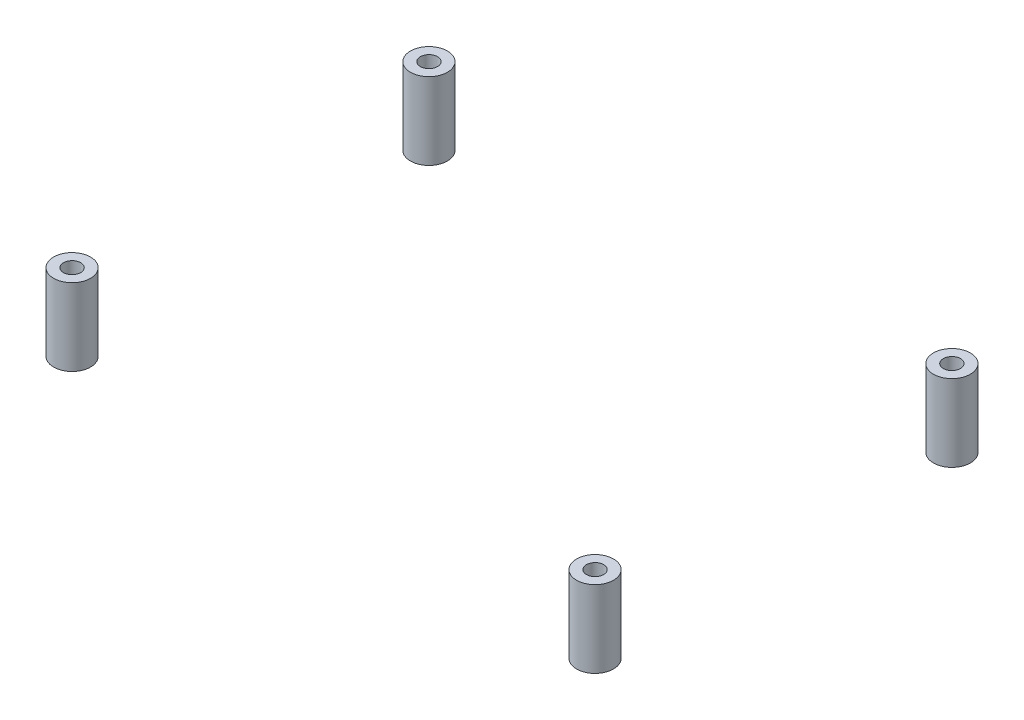
ISO-10303-21;
HEADER;
FILE_DESCRIPTION(('STEP AP214'),'2;1');
FILE_NAME('part.step','',(''),(''),'','','');
FILE_SCHEMA(('AUTOMOTIVE_DESIGN { 1 0 10303 214 1 1 1 1 }'));
ENDSEC;
DATA;
#1=APPLICATION_CONTEXT('core data for automotive mechanical design processes');
#2=APPLICATION_PROTOCOL_DEFINITION('international standard','automotive_design',2000,#1);
#3=PRODUCT_CONTEXT('',#1,'mechanical');
#4=PRODUCT('Part','Part','',(#3));
#5=PRODUCT_RELATED_PRODUCT_CATEGORY('part','',(#4));
#6=PRODUCT_DEFINITION_FORMATION('','',#4);
#7=PRODUCT_DEFINITION_CONTEXT('part definition',#1,'design');
#8=PRODUCT_DEFINITION('design','',#6,#7);
#9=PRODUCT_DEFINITION_SHAPE('','',#8);
#10=(LENGTH_UNIT() NAMED_UNIT(*) SI_UNIT(.MILLI.,.METRE.));
#11=(NAMED_UNIT(*) PLANE_ANGLE_UNIT() SI_UNIT($,.RADIAN.));
#12=(NAMED_UNIT(*) SI_UNIT($,.STERADIAN.) SOLID_ANGLE_UNIT());
#13=UNCERTAINTY_MEASURE_WITH_UNIT(LENGTH_MEASURE(1.E-05),#10,'distance_accuracy_value','');
#14=(GEOMETRIC_REPRESENTATION_CONTEXT(3) GLOBAL_UNCERTAINTY_ASSIGNED_CONTEXT((#13)) GLOBAL_UNIT_ASSIGNED_CONTEXT((#10,
#11,#12)) REPRESENTATION_CONTEXT('',''));
#15=CARTESIAN_POINT('',(0.,0.,0.));
#16=DIRECTION('',(0.,0.,1.));
#17=DIRECTION('',(1.,0.,0.));
#18=AXIS2_PLACEMENT_3D('',#15,#16,#17);
#19=CARTESIAN_POINT('',(64.7928008223971,12.5,-22.4155788664338));
#20=DIRECTION('',(0.,-1.,0.));
#21=DIRECTION('',(0.,0.,-1.));
#22=AXIS2_PLACEMENT_3D('',#19,#20,#21);
#23=CYLINDRICAL_SURFACE('',#22,3.00000000000001);
#24=CARTESIAN_POINT('',(64.7928008223971,12.5,-22.4155788664338));
#25=DIRECTION('',(0.,1.,0.));
#26=DIRECTION('',(0.,0.,1.));
#27=AXIS2_PLACEMENT_3D('',#24,#25,#26);
#28=CIRCLE('',#27,3.00000000000001);
#29=CARTESIAN_POINT('',(64.7928008223971,12.5,-19.4155788664338));
#30=VERTEX_POINT('',#29);
#31=EDGE_CURVE('E11',#30,#30,#28,.F.);
#32=ORIENTED_EDGE('',*,*,#31,.T.);
#33=EDGE_LOOP('',(#32));
#34=FACE_BOUND('',#33,.T.);
#35=CARTESIAN_POINT('',(64.7928008223971,0.,-22.4155788664338));
#36=DIRECTION('',(0.,1.,0.));
#37=DIRECTION('',(0.,0.,1.));
#38=AXIS2_PLACEMENT_3D('',#35,#36,#37);
#39=CIRCLE('',#38,3.00000000000001);
#40=CARTESIAN_POINT('',(64.7928008223971,0.,-19.4155788664338));
#41=VERTEX_POINT('',#40);
#42=EDGE_CURVE('E51',#41,#41,#39,.F.);
#43=ORIENTED_EDGE('',*,*,#42,.F.);
#44=EDGE_LOOP('',(#43));
#45=FACE_BOUND('',#44,.T.);
#46=ADVANCED_FACE('F48',(#34,#45),#23,.T.);
#47=CARTESIAN_POINT('',(0.,12.5,0.));
#48=DIRECTION('',(0.,1.,0.));
#49=DIRECTION('',(0.,0.,1.));
#50=AXIS2_PLACEMENT_3D('',#47,#48,#49);
#51=PLANE('',#50);
#52=CARTESIAN_POINT('',(64.7928008223971,12.5,-22.4155788664338));
#53=DIRECTION('',(0.,1.,0.));
#54=DIRECTION('',(0.,0.,1.));
#55=AXIS2_PLACEMENT_3D('',#52,#53,#54);
#56=CIRCLE('',#55,1.4);
#57=CARTESIAN_POINT('',(64.7928008223971,12.5,-21.0155788664338));
#58=VERTEX_POINT('',#57);
#59=EDGE_CURVE('E58',#58,#58,#56,.T.);
#60=ORIENTED_EDGE('',*,*,#59,.F.);
#61=EDGE_LOOP('',(#60));
#62=FACE_BOUND('',#61,.T.);
#63=ORIENTED_EDGE('',*,*,#31,.F.);
#64=EDGE_LOOP('',(#63));
#65=FACE_BOUND('',#64,.T.);
#66=ADVANCED_FACE('F68',(#62,#65),#51,.T.);
#67=CARTESIAN_POINT('',(0.,0.,0.));
#68=DIRECTION('',(0.,1.,0.));
#69=DIRECTION('',(0.,0.,1.));
#70=AXIS2_PLACEMENT_3D('',#67,#68,#69);
#71=PLANE('',#70);
#72=ORIENTED_EDGE('',*,*,#42,.T.);
#73=EDGE_LOOP('',(#72));
#74=FACE_BOUND('',#73,.T.);
#75=ADVANCED_FACE('F71',(#74),#71,.F.);
#76=CARTESIAN_POINT('',(64.7928008223971,2.5,-22.4155788664338));
#77=DIRECTION('',(0.,1.,0.));
#78=DIRECTION('',(0.,0.,1.));
#79=AXIS2_PLACEMENT_3D('',#76,#77,#78);
#80=CYLINDRICAL_SURFACE('',#79,1.4);
#81=CARTESIAN_POINT('',(64.7928008223971,2.5,-22.4155788664338));
#82=DIRECTION('',(0.,1.,0.));
#83=DIRECTION('',(0.,0.,1.));
#84=AXIS2_PLACEMENT_3D('',#81,#82,#83);
#85=CIRCLE('',#84,1.4);
#86=CARTESIAN_POINT('',(64.7928008223971,2.5,-21.0155788664338));
#87=VERTEX_POINT('',#86);
#88=EDGE_CURVE('E60',#87,#87,#85,.T.);
#89=ORIENTED_EDGE('',*,*,#88,.F.);
#90=EDGE_LOOP('',(#89));
#91=FACE_BOUND('',#90,.T.);
#92=ORIENTED_EDGE('',*,*,#59,.T.);
#93=EDGE_LOOP('',(#92));
#94=FACE_BOUND('',#93,.T.);
#95=ADVANCED_FACE('F66',(#91,#94),#80,.F.);
#96=CARTESIAN_POINT('',(64.7928008223971,2.5,-22.4155788664338));
#97=DIRECTION('',(0.,1.,0.));
#98=DIRECTION('',(0.,0.,1.));
#99=AXIS2_PLACEMENT_3D('',#96,#97,#98);
#100=PLANE('',#99);
#101=ORIENTED_EDGE('',*,*,#88,.T.);
#102=EDGE_LOOP('',(#101));
#103=FACE_BOUND('',#102,.T.);
#104=ADVANCED_FACE('F80',(#103),#100,.T.);
#105=CLOSED_SHELL('',(#46,#66,#75,#95,#104));
#106=MANIFOLD_SOLID_BREP('B2',#105);
#107=CARTESIAN_POINT('',(64.7928008223971,12.5,35.5844211335662));
#108=DIRECTION('',(0.,-1.,0.));
#109=DIRECTION('',(0.,0.,-1.));
#110=AXIS2_PLACEMENT_3D('',#107,#108,#109);
#111=CYLINDRICAL_SURFACE('',#110,3.00000000000001);
#112=CARTESIAN_POINT('',(64.7928008223971,12.5,35.5844211335662));
#113=DIRECTION('',(0.,1.,0.));
#114=DIRECTION('',(0.,0.,1.));
#115=AXIS2_PLACEMENT_3D('',#112,#113,#114);
#116=CIRCLE('',#115,3.00000000000001);
#117=CARTESIAN_POINT('',(64.7928008223971,12.5,38.5844211335662));
#118=VERTEX_POINT('',#117);
#119=EDGE_CURVE('E47',#118,#118,#116,.T.);
#120=ORIENTED_EDGE('',*,*,#119,.F.);
#121=EDGE_LOOP('',(#120));
#122=FACE_BOUND('',#121,.T.);
#123=CARTESIAN_POINT('',(64.7928008223971,0.,35.5844211335662));
#124=DIRECTION('',(0.,1.,0.));
#125=DIRECTION('',(0.,0.,1.));
#126=AXIS2_PLACEMENT_3D('',#123,#124,#125);
#127=CIRCLE('',#126,3.00000000000001);
#128=CARTESIAN_POINT('',(64.7928008223971,0.,38.5844211335662));
#129=VERTEX_POINT('',#128);
#130=EDGE_CURVE('E136',#129,#129,#127,.T.);
#131=ORIENTED_EDGE('',*,*,#130,.T.);
#132=EDGE_LOOP('',(#131));
#133=FACE_BOUND('',#132,.T.);
#134=ADVANCED_FACE('F133',(#122,#133),#111,.T.);
#135=CARTESIAN_POINT('',(0.,12.5,0.));
#136=DIRECTION('',(0.,1.,0.));
#137=DIRECTION('',(0.,0.,1.));
#138=AXIS2_PLACEMENT_3D('',#135,#136,#137);
#139=PLANE('',#138);
#140=CARTESIAN_POINT('',(64.7928008223971,12.5,35.5844211335662));
#141=DIRECTION('',(0.,1.,0.));
#142=DIRECTION('',(0.,0.,1.));
#143=AXIS2_PLACEMENT_3D('',#140,#141,#142);
#144=CIRCLE('',#143,1.4);
#145=CARTESIAN_POINT('',(64.7928008223971,12.5,36.9844211335662));
#146=VERTEX_POINT('',#145);
#147=EDGE_CURVE('E143',#146,#146,#144,.T.);
#148=ORIENTED_EDGE('',*,*,#147,.F.);
#149=EDGE_LOOP('',(#148));
#150=FACE_BOUND('',#149,.T.);
#151=ORIENTED_EDGE('',*,*,#119,.T.);
#152=EDGE_LOOP('',(#151));
#153=FACE_BOUND('',#152,.T.);
#154=ADVANCED_FACE('F153',(#150,#153),#139,.T.);
#155=CARTESIAN_POINT('',(0.,0.,0.));
#156=DIRECTION('',(0.,1.,0.));
#157=DIRECTION('',(0.,0.,1.));
#158=AXIS2_PLACEMENT_3D('',#155,#156,#157);
#159=PLANE('',#158);
#160=ORIENTED_EDGE('',*,*,#130,.F.);
#161=EDGE_LOOP('',(#160));
#162=FACE_BOUND('',#161,.T.);
#163=ADVANCED_FACE('F155',(#162),#159,.F.);
#164=CARTESIAN_POINT('',(64.7928008223971,2.5,35.5844211335662));
#165=DIRECTION('',(0.,1.,0.));
#166=DIRECTION('',(0.,0.,1.));
#167=AXIS2_PLACEMENT_3D('',#164,#165,#166);
#168=CYLINDRICAL_SURFACE('',#167,1.4);
#169=CARTESIAN_POINT('',(64.7928008223971,2.5,35.5844211335662));
#170=DIRECTION('',(0.,1.,0.));
#171=DIRECTION('',(0.,0.,1.));
#172=AXIS2_PLACEMENT_3D('',#169,#170,#171);
#173=CIRCLE('',#172,1.4);
#174=CARTESIAN_POINT('',(64.7928008223971,2.5,36.9844211335662));
#175=VERTEX_POINT('',#174);
#176=EDGE_CURVE('E145',#175,#175,#173,.T.);
#177=ORIENTED_EDGE('',*,*,#176,.F.);
#178=EDGE_LOOP('',(#177));
#179=FACE_BOUND('',#178,.T.);
#180=ORIENTED_EDGE('',*,*,#147,.T.);
#181=EDGE_LOOP('',(#180));
#182=FACE_BOUND('',#181,.T.);
#183=ADVANCED_FACE('F151',(#179,#182),#168,.F.);
#184=CARTESIAN_POINT('',(64.7928008223971,2.5,35.5844211335662));
#185=DIRECTION('',(0.,1.,0.));
#186=DIRECTION('',(0.,0.,1.));
#187=AXIS2_PLACEMENT_3D('',#184,#185,#186);
#188=PLANE('',#187);
#189=ORIENTED_EDGE('',*,*,#176,.T.);
#190=EDGE_LOOP('',(#189));
#191=FACE_BOUND('',#190,.T.);
#192=ADVANCED_FACE('F165',(#191),#188,.T.);
#193=CLOSED_SHELL('',(#134,#154,#163,#183,#192));
#194=MANIFOLD_SOLID_BREP('B6',#193);
#195=CARTESIAN_POINT('',(-20.2071991776029,12.5,-22.4155788664338));
#196=DIRECTION('',(0.,-1.,0.));
#197=DIRECTION('',(0.,0.,-1.));
#198=AXIS2_PLACEMENT_3D('',#195,#196,#197);
#199=CYLINDRICAL_SURFACE('',#198,3.);
#200=CARTESIAN_POINT('',(-20.2071991776029,12.5,-22.4155788664338));
#201=DIRECTION('',(0.,1.,0.));
#202=DIRECTION('',(0.,0.,1.));
#203=AXIS2_PLACEMENT_3D('',#200,#201,#202);
#204=CIRCLE('',#203,3.);
#205=CARTESIAN_POINT('',(-20.2071991776029,12.5,-19.4155788664338));
#206=VERTEX_POINT('',#205);
#207=EDGE_CURVE('E132',#206,#206,#204,.T.);
#208=ORIENTED_EDGE('',*,*,#207,.F.);
#209=EDGE_LOOP('',(#208));
#210=FACE_BOUND('',#209,.T.);
#211=CARTESIAN_POINT('',(-20.2071991776029,0.,-22.4155788664338));
#212=DIRECTION('',(0.,1.,0.));
#213=DIRECTION('',(0.,0.,1.));
#214=AXIS2_PLACEMENT_3D('',#211,#212,#213);
#215=CIRCLE('',#214,3.);
#216=CARTESIAN_POINT('',(-20.2071991776029,0.,-19.4155788664338));
#217=VERTEX_POINT('',#216);
#218=EDGE_CURVE('E220',#217,#217,#215,.T.);
#219=ORIENTED_EDGE('',*,*,#218,.T.);
#220=EDGE_LOOP('',(#219));
#221=FACE_BOUND('',#220,.T.);
#222=ADVANCED_FACE('F217',(#210,#221),#199,.T.);
#223=CARTESIAN_POINT('',(0.,12.5,0.));
#224=DIRECTION('',(0.,1.,0.));
#225=DIRECTION('',(0.,0.,1.));
#226=AXIS2_PLACEMENT_3D('',#223,#224,#225);
#227=PLANE('',#226);
#228=CARTESIAN_POINT('',(-20.2071991776029,12.5,-22.4155788664338));
#229=DIRECTION('',(0.,1.,0.));
#230=DIRECTION('',(0.,0.,1.));
#231=AXIS2_PLACEMENT_3D('',#228,#229,#230);
#232=CIRCLE('',#231,1.4);
#233=CARTESIAN_POINT('',(-20.2071991776029,12.5,-21.0155788664338));
#234=VERTEX_POINT('',#233);
#235=EDGE_CURVE('E229',#234,#234,#232,.T.);
#236=ORIENTED_EDGE('',*,*,#235,.F.);
#237=EDGE_LOOP('',(#236));
#238=FACE_BOUND('',#237,.T.);
#239=ORIENTED_EDGE('',*,*,#207,.T.);
#240=EDGE_LOOP('',(#239));
#241=FACE_BOUND('',#240,.T.);
#242=ADVANCED_FACE('F244',(#238,#241),#227,.T.);
#243=CARTESIAN_POINT('',(0.,0.,0.));
#244=DIRECTION('',(0.,1.,0.));
#245=DIRECTION('',(0.,0.,1.));
#246=AXIS2_PLACEMENT_3D('',#243,#244,#245);
#247=PLANE('',#246);
#248=ORIENTED_EDGE('',*,*,#218,.F.);
#249=EDGE_LOOP('',(#248));
#250=FACE_BOUND('',#249,.T.);
#251=ADVANCED_FACE('F240',(#250),#247,.F.);
#252=CARTESIAN_POINT('',(-20.2071991776029,2.5,-22.4155788664338));
#253=DIRECTION('',(0.,1.,0.));
#254=DIRECTION('',(0.,0.,1.));
#255=AXIS2_PLACEMENT_3D('',#252,#253,#254);
#256=CYLINDRICAL_SURFACE('',#255,1.4);
#257=CARTESIAN_POINT('',(-20.2071991776029,2.5,-22.4155788664338));
#258=DIRECTION('',(0.,1.,0.));
#259=DIRECTION('',(0.,0.,1.));
#260=AXIS2_PLACEMENT_3D('',#257,#258,#259);
#261=CIRCLE('',#260,1.4);
#262=CARTESIAN_POINT('',(-20.2071991776029,2.5,-21.0155788664338));
#263=VERTEX_POINT('',#262);
#264=EDGE_CURVE('E227',#263,#263,#261,.T.);
#265=ORIENTED_EDGE('',*,*,#264,.F.);
#266=EDGE_LOOP('',(#265));
#267=FACE_BOUND('',#266,.T.);
#268=ORIENTED_EDGE('',*,*,#235,.T.);
#269=EDGE_LOOP('',(#268));
#270=FACE_BOUND('',#269,.T.);
#271=ADVANCED_FACE('F237',(#267,#270),#256,.F.);
#272=CARTESIAN_POINT('',(-20.2071991776029,2.5,-22.4155788664338));
#273=DIRECTION('',(0.,1.,0.));
#274=DIRECTION('',(0.,0.,1.));
#275=AXIS2_PLACEMENT_3D('',#272,#273,#274);
#276=PLANE('',#275);
#277=ORIENTED_EDGE('',*,*,#264,.T.);
#278=EDGE_LOOP('',(#277));
#279=FACE_BOUND('',#278,.T.);
#280=ADVANCED_FACE('F235',(#279),#276,.T.);
#281=CLOSED_SHELL('',(#222,#242,#251,#271,#280));
#282=MANIFOLD_SOLID_BREP('B42',#281);
#283=CARTESIAN_POINT('',(-20.2071991776029,12.5,35.5844211335662));
#284=DIRECTION('',(0.,-1.,0.));
#285=DIRECTION('',(0.,0.,-1.));
#286=AXIS2_PLACEMENT_3D('',#283,#284,#285);
#287=CYLINDRICAL_SURFACE('',#286,3.);
#288=CARTESIAN_POINT('',(-20.2071991776029,12.5,35.5844211335662));
#289=DIRECTION('',(0.,1.,0.));
#290=DIRECTION('',(0.,0.,1.));
#291=AXIS2_PLACEMENT_3D('',#288,#289,#290);
#292=CIRCLE('',#291,3.);
#293=CARTESIAN_POINT('',(-20.2071991776029,12.5,38.5844211335662));
#294=VERTEX_POINT('',#293);
#295=EDGE_CURVE('E216',#294,#294,#292,.F.);
#296=ORIENTED_EDGE('',*,*,#295,.T.);
#297=EDGE_LOOP('',(#296));
#298=FACE_BOUND('',#297,.T.);
#299=CARTESIAN_POINT('',(-20.2071991776029,0.,35.5844211335662));
#300=DIRECTION('',(0.,1.,0.));
#301=DIRECTION('',(0.,0.,1.));
#302=AXIS2_PLACEMENT_3D('',#299,#300,#301);
#303=CIRCLE('',#302,3.);
#304=CARTESIAN_POINT('',(-20.2071991776029,0.,38.5844211335662));
#305=VERTEX_POINT('',#304);
#306=EDGE_CURVE('E297',#305,#305,#303,.F.);
#307=ORIENTED_EDGE('',*,*,#306,.F.);
#308=EDGE_LOOP('',(#307));
#309=FACE_BOUND('',#308,.T.);
#310=ADVANCED_FACE('F294',(#298,#309),#287,.T.);
#311=CARTESIAN_POINT('',(0.,12.5,0.));
#312=DIRECTION('',(0.,1.,0.));
#313=DIRECTION('',(0.,0.,1.));
#314=AXIS2_PLACEMENT_3D('',#311,#312,#313);
#315=PLANE('',#314);
#316=CARTESIAN_POINT('',(-20.2071991776029,12.5,35.5844211335662));
#317=DIRECTION('',(0.,1.,0.));
#318=DIRECTION('',(0.,0.,1.));
#319=AXIS2_PLACEMENT_3D('',#316,#317,#318);
#320=CIRCLE('',#319,1.4);
#321=CARTESIAN_POINT('',(-20.2071991776029,12.5,36.9844211335662));
#322=VERTEX_POINT('',#321);
#323=EDGE_CURVE('E304',#322,#322,#320,.T.);
#324=ORIENTED_EDGE('',*,*,#323,.F.);
#325=EDGE_LOOP('',(#324));
#326=FACE_BOUND('',#325,.T.);
#327=ORIENTED_EDGE('',*,*,#295,.F.);
#328=EDGE_LOOP('',(#327));
#329=FACE_BOUND('',#328,.T.);
#330=ADVANCED_FACE('F314',(#326,#329),#315,.T.);
#331=CARTESIAN_POINT('',(0.,0.,0.));
#332=DIRECTION('',(0.,1.,0.));
#333=DIRECTION('',(0.,0.,1.));
#334=AXIS2_PLACEMENT_3D('',#331,#332,#333);
#335=PLANE('',#334);
#336=ORIENTED_EDGE('',*,*,#306,.T.);
#337=EDGE_LOOP('',(#336));
#338=FACE_BOUND('',#337,.T.);
#339=ADVANCED_FACE('F317',(#338),#335,.F.);
#340=CARTESIAN_POINT('',(-20.2071991776029,2.5,35.5844211335662));
#341=DIRECTION('',(0.,1.,0.));
#342=DIRECTION('',(0.,0.,1.));
#343=AXIS2_PLACEMENT_3D('',#340,#341,#342);
#344=CYLINDRICAL_SURFACE('',#343,1.4);
#345=CARTESIAN_POINT('',(-20.2071991776029,2.5,35.5844211335662));
#346=DIRECTION('',(0.,1.,0.));
#347=DIRECTION('',(0.,0.,1.));
#348=AXIS2_PLACEMENT_3D('',#345,#346,#347);
#349=CIRCLE('',#348,1.4);
#350=CARTESIAN_POINT('',(-20.2071991776029,2.5,36.9844211335662));
#351=VERTEX_POINT('',#350);
#352=EDGE_CURVE('E306',#351,#351,#349,.T.);
#353=ORIENTED_EDGE('',*,*,#352,.F.);
#354=EDGE_LOOP('',(#353));
#355=FACE_BOUND('',#354,.T.);
#356=ORIENTED_EDGE('',*,*,#323,.T.);
#357=EDGE_LOOP('',(#356));
#358=FACE_BOUND('',#357,.T.);
#359=ADVANCED_FACE('F312',(#355,#358),#344,.F.);
#360=CARTESIAN_POINT('',(-20.2071991776029,2.5,35.5844211335662));
#361=DIRECTION('',(0.,1.,0.));
#362=DIRECTION('',(0.,0.,1.));
#363=AXIS2_PLACEMENT_3D('',#360,#361,#362);
#364=PLANE('',#363);
#365=ORIENTED_EDGE('',*,*,#352,.T.);
#366=EDGE_LOOP('',(#365));
#367=FACE_BOUND('',#366,.T.);
#368=ADVANCED_FACE('F326',(#367),#364,.T.);
#369=CLOSED_SHELL('',(#310,#330,#339,#359,#368));
#370=MANIFOLD_SOLID_BREP('B127',#369);
#371=ADVANCED_BREP_SHAPE_REPRESENTATION('',(#18,#106,#194,#282,#370),#14);
#372=SHAPE_DEFINITION_REPRESENTATION(#9,#371);
ENDSEC;
END-ISO-10303-21;
